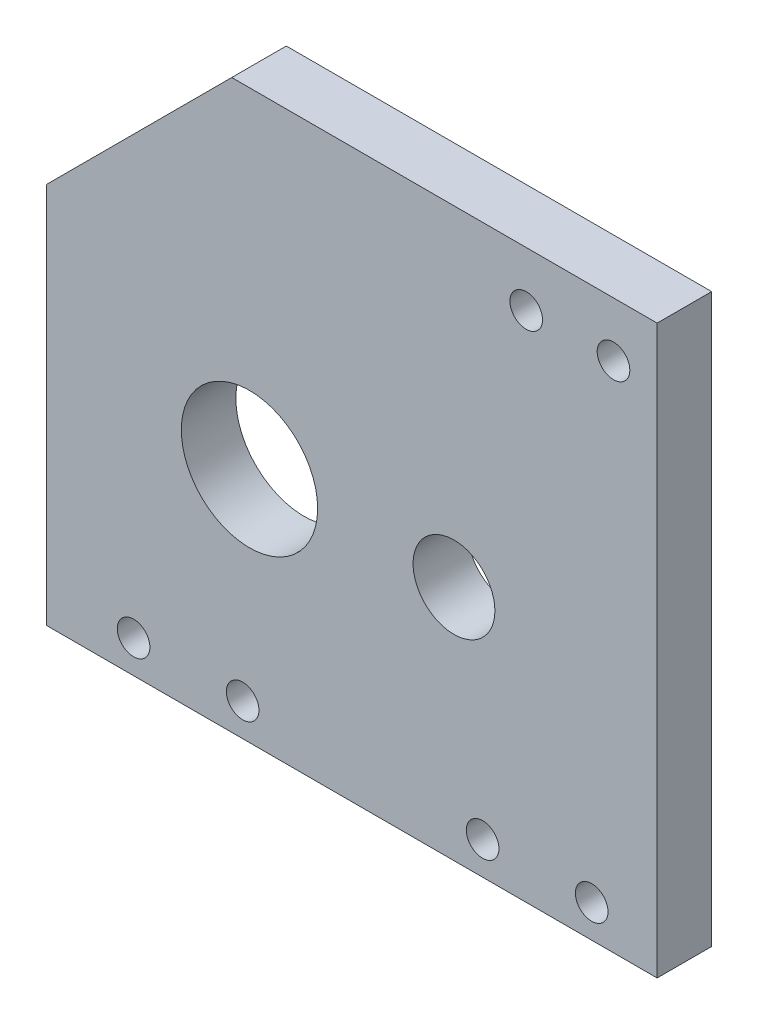
ISO-10303-21;
HEADER;
FILE_DESCRIPTION(('STEP AP214'),'2;1');
FILE_NAME('part.step','',(''),(''),'','','');
FILE_SCHEMA(('AUTOMOTIVE_DESIGN { 1 0 10303 214 1 1 1 1 }'));
ENDSEC;
DATA;
#1=APPLICATION_CONTEXT('core data for automotive mechanical design processes');
#2=APPLICATION_PROTOCOL_DEFINITION('international standard','automotive_design',2000,#1);
#3=PRODUCT_CONTEXT('',#1,'mechanical');
#4=PRODUCT('Part','Part','',(#3));
#5=PRODUCT_RELATED_PRODUCT_CATEGORY('part','',(#4));
#6=PRODUCT_DEFINITION_FORMATION('','',#4);
#7=PRODUCT_DEFINITION_CONTEXT('part definition',#1,'design');
#8=PRODUCT_DEFINITION('design','',#6,#7);
#9=PRODUCT_DEFINITION_SHAPE('','',#8);
#10=(LENGTH_UNIT() NAMED_UNIT(*) SI_UNIT(.MILLI.,.METRE.));
#11=(NAMED_UNIT(*) PLANE_ANGLE_UNIT() SI_UNIT($,.RADIAN.));
#12=(NAMED_UNIT(*) SI_UNIT($,.STERADIAN.) SOLID_ANGLE_UNIT());
#13=UNCERTAINTY_MEASURE_WITH_UNIT(LENGTH_MEASURE(1.E-05),#10,'distance_accuracy_value','');
#14=(GEOMETRIC_REPRESENTATION_CONTEXT(3) GLOBAL_UNCERTAINTY_ASSIGNED_CONTEXT((#13)) GLOBAL_UNIT_ASSIGNED_CONTEXT((#10,
#11,#12)) REPRESENTATION_CONTEXT('',''));
#15=CARTESIAN_POINT('',(0.,0.,0.));
#16=DIRECTION('',(0.,0.,1.));
#17=DIRECTION('',(1.,0.,0.));
#18=AXIS2_PLACEMENT_3D('',#15,#16,#17);
#19=CARTESIAN_POINT('',(0.,0.,6.35));
#20=DIRECTION('',(0.,0.,1.));
#21=DIRECTION('',(1.,0.,0.));
#22=AXIS2_PLACEMENT_3D('',#19,#20,#21);
#23=PLANE('',#22);
#24=CARTESIAN_POINT('',(20.32,26.67,6.35));
#25=DIRECTION('',(0.,0.,1.));
#26=DIRECTION('',(1.,0.,0.));
#27=AXIS2_PLACEMENT_3D('',#24,#25,#26);
#28=CIRCLE('',#27,1.89864999999999);
#29=CARTESIAN_POINT('',(22.21865,26.67,6.35));
#30=VERTEX_POINT('',#29);
#31=EDGE_CURVE('E173',#30,#30,#28,.T.);
#32=ORIENTED_EDGE('',*,*,#31,.F.);
#33=EDGE_LOOP('',(#32));
#34=FACE_BOUND('',#33,.T.);
#35=CARTESIAN_POINT('',(30.48,26.67,6.35));
#36=DIRECTION('',(0.,0.,1.));
#37=DIRECTION('',(1.,0.,0.));
#38=AXIS2_PLACEMENT_3D('',#35,#36,#37);
#39=CIRCLE('',#38,1.89864999999999);
#40=CARTESIAN_POINT('',(32.37865,26.67,6.35));
#41=VERTEX_POINT('',#40);
#42=EDGE_CURVE('E167',#41,#41,#39,.T.);
#43=ORIENTED_EDGE('',*,*,#42,.F.);
#44=EDGE_LOOP('',(#43));
#45=FACE_BOUND('',#44,.T.);
#46=DIRECTION('',(0.707106781186547,0.707106781186548,0.));
#47=VECTOR('',#46,1.);
#48=CARTESIAN_POINT('',(-13.97,33.02,6.35));
#49=LINE('',#48,#47);
#50=CARTESIAN_POINT('',(-35.56,11.43,6.35));
#51=VERTEX_POINT('',#50);
#52=CARTESIAN_POINT('',(-13.97,33.02,6.35));
#53=VERTEX_POINT('',#52);
#54=EDGE_CURVE('E48',#51,#53,#49,.T.);
#55=ORIENTED_EDGE('',*,*,#54,.F.);
#56=DIRECTION('',(0.,-1.,0.));
#57=VECTOR('',#56,1.);
#58=CARTESIAN_POINT('',(-35.56,-33.02,6.35));
#59=LINE('',#58,#57);
#60=CARTESIAN_POINT('',(-35.56,-33.02,6.35));
#61=VERTEX_POINT('',#60);
#62=EDGE_CURVE('E78',#51,#61,#59,.T.);
#63=ORIENTED_EDGE('',*,*,#62,.T.);
#64=DIRECTION('',(1.,0.,0.));
#65=VECTOR('',#64,1.);
#66=CARTESIAN_POINT('',(35.56,-33.02,6.35));
#67=LINE('',#66,#65);
#68=CARTESIAN_POINT('',(35.56,-33.02,6.35));
#69=VERTEX_POINT('',#68);
#70=EDGE_CURVE('E108',#61,#69,#67,.T.);
#71=ORIENTED_EDGE('',*,*,#70,.T.);
#72=DIRECTION('',(0.,1.,0.));
#73=VECTOR('',#72,1.);
#74=CARTESIAN_POINT('',(35.56,-33.02,6.35));
#75=LINE('',#74,#73);
#76=CARTESIAN_POINT('',(35.56,33.02,6.35));
#77=VERTEX_POINT('',#76);
#78=EDGE_CURVE('E57',#69,#77,#75,.T.);
#79=ORIENTED_EDGE('',*,*,#78,.T.);
#80=DIRECTION('',(-1.,0.,0.));
#81=VECTOR('',#80,1.);
#82=CARTESIAN_POINT('',(35.56,33.02,6.35));
#83=LINE('',#82,#81);
#84=EDGE_CURVE('E114',#77,#53,#83,.T.);
#85=ORIENTED_EDGE('',*,*,#84,.T.);
#86=EDGE_LOOP('',(#55,#63,#71,#79,#85));
#87=FACE_BOUND('',#86,.T.);
#88=CARTESIAN_POINT('',(-25.4,-29.21,6.35));
#89=DIRECTION('',(0.,0.,1.));
#90=DIRECTION('',(1.,0.,0.));
#91=AXIS2_PLACEMENT_3D('',#88,#89,#90);
#92=CIRCLE('',#91,1.89864999999999);
#93=CARTESIAN_POINT('',(-23.50135,-29.21,6.35));
#94=VERTEX_POINT('',#93);
#95=EDGE_CURVE('E159',#94,#94,#92,.T.);
#96=ORIENTED_EDGE('',*,*,#95,.F.);
#97=EDGE_LOOP('',(#96));
#98=FACE_BOUND('',#97,.T.);
#99=CARTESIAN_POINT('',(-12.7,-29.21,6.35));
#100=DIRECTION('',(0.,0.,1.));
#101=DIRECTION('',(1.,0.,0.));
#102=AXIS2_PLACEMENT_3D('',#99,#100,#101);
#103=CIRCLE('',#102,1.89864999999999);
#104=CARTESIAN_POINT('',(-10.80135,-29.21,6.35));
#105=VERTEX_POINT('',#104);
#106=EDGE_CURVE('E153',#105,#105,#103,.T.);
#107=ORIENTED_EDGE('',*,*,#106,.F.);
#108=EDGE_LOOP('',(#107));
#109=FACE_BOUND('',#108,.T.);
#110=CARTESIAN_POINT('',(15.24,-29.21,6.35));
#111=DIRECTION('',(0.,0.,1.));
#112=DIRECTION('',(1.,0.,0.));
#113=AXIS2_PLACEMENT_3D('',#110,#111,#112);
#114=CIRCLE('',#113,1.89864999999999);
#115=CARTESIAN_POINT('',(17.13865,-29.21,6.35));
#116=VERTEX_POINT('',#115);
#117=EDGE_CURVE('E147',#116,#116,#114,.T.);
#118=ORIENTED_EDGE('',*,*,#117,.F.);
#119=EDGE_LOOP('',(#118));
#120=FACE_BOUND('',#119,.T.);
#121=CARTESIAN_POINT('',(27.94,-29.21,6.35));
#122=DIRECTION('',(0.,0.,1.));
#123=DIRECTION('',(1.,0.,0.));
#124=AXIS2_PLACEMENT_3D('',#121,#122,#123);
#125=CIRCLE('',#124,1.89864999999999);
#126=CARTESIAN_POINT('',(29.83865,-29.21,6.35));
#127=VERTEX_POINT('',#126);
#128=EDGE_CURVE('E141',#127,#127,#125,.T.);
#129=ORIENTED_EDGE('',*,*,#128,.F.);
#130=EDGE_LOOP('',(#129));
#131=FACE_BOUND('',#130,.T.);
#132=CARTESIAN_POINT('',(-11.90625,-5.43814,6.35));
#133=DIRECTION('',(0.,0.,1.));
#134=DIRECTION('',(1.,0.,0.));
#135=AXIS2_PLACEMENT_3D('',#132,#133,#134);
#136=CIRCLE('',#135,7.9375);
#137=CARTESIAN_POINT('',(-3.96875,-5.43814,6.35));
#138=VERTEX_POINT('',#137);
#139=EDGE_CURVE('E121',#138,#138,#136,.T.);
#140=ORIENTED_EDGE('',*,*,#139,.F.);
#141=EDGE_LOOP('',(#140));
#142=FACE_BOUND('',#141,.T.);
#143=CARTESIAN_POINT('',(11.90625,-5.43814,6.35));
#144=DIRECTION('',(0.,0.,1.));
#145=DIRECTION('',(1.,0.,0.));
#146=AXIS2_PLACEMENT_3D('',#143,#144,#145);
#147=CIRCLE('',#146,4.7625);
#148=CARTESIAN_POINT('',(16.66875,-5.43814,6.35));
#149=VERTEX_POINT('',#148);
#150=EDGE_CURVE('E131',#149,#149,#147,.T.);
#151=ORIENTED_EDGE('',*,*,#150,.F.);
#152=EDGE_LOOP('',(#151));
#153=FACE_BOUND('',#152,.T.);
#154=ADVANCED_FACE('F33',(#34,#45,#87,#98,#109,#120,#131,#142,#153),#23,.T.);
#155=CARTESIAN_POINT('',(0.,0.,0.));
#156=DIRECTION('',(0.,0.,1.));
#157=DIRECTION('',(1.,0.,0.));
#158=AXIS2_PLACEMENT_3D('',#155,#156,#157);
#159=PLANE('',#158);
#160=CARTESIAN_POINT('',(20.32,26.67,0.));
#161=DIRECTION('',(0.,0.,1.));
#162=DIRECTION('',(1.,0.,0.));
#163=AXIS2_PLACEMENT_3D('',#160,#161,#162);
#164=CIRCLE('',#163,1.89864999999999);
#165=CARTESIAN_POINT('',(22.21865,26.67,0.));
#166=VERTEX_POINT('',#165);
#167=EDGE_CURVE('E170',#166,#166,#164,.T.);
#168=ORIENTED_EDGE('',*,*,#167,.T.);
#169=EDGE_LOOP('',(#168));
#170=FACE_BOUND('',#169,.T.);
#171=CARTESIAN_POINT('',(30.48,26.67,0.));
#172=DIRECTION('',(0.,0.,1.));
#173=DIRECTION('',(1.,0.,0.));
#174=AXIS2_PLACEMENT_3D('',#171,#172,#173);
#175=CIRCLE('',#174,1.89864999999999);
#176=CARTESIAN_POINT('',(32.37865,26.67,0.));
#177=VERTEX_POINT('',#176);
#178=EDGE_CURVE('E163',#177,#177,#175,.T.);
#179=ORIENTED_EDGE('',*,*,#178,.T.);
#180=EDGE_LOOP('',(#179));
#181=FACE_BOUND('',#180,.T.);
#182=CARTESIAN_POINT('',(-25.4,-29.21,0.));
#183=DIRECTION('',(0.,0.,1.));
#184=DIRECTION('',(1.,0.,0.));
#185=AXIS2_PLACEMENT_3D('',#182,#183,#184);
#186=CIRCLE('',#185,1.89864999999999);
#187=CARTESIAN_POINT('',(-23.50135,-29.21,0.));
#188=VERTEX_POINT('',#187);
#189=EDGE_CURVE('E156',#188,#188,#186,.T.);
#190=ORIENTED_EDGE('',*,*,#189,.T.);
#191=EDGE_LOOP('',(#190));
#192=FACE_BOUND('',#191,.T.);
#193=CARTESIAN_POINT('',(-12.7,-29.21,0.));
#194=DIRECTION('',(0.,0.,1.));
#195=DIRECTION('',(1.,0.,0.));
#196=AXIS2_PLACEMENT_3D('',#193,#194,#195);
#197=CIRCLE('',#196,1.89864999999999);
#198=CARTESIAN_POINT('',(-10.80135,-29.21,0.));
#199=VERTEX_POINT('',#198);
#200=EDGE_CURVE('E150',#199,#199,#197,.T.);
#201=ORIENTED_EDGE('',*,*,#200,.T.);
#202=EDGE_LOOP('',(#201));
#203=FACE_BOUND('',#202,.T.);
#204=CARTESIAN_POINT('',(15.24,-29.21,0.));
#205=DIRECTION('',(0.,0.,1.));
#206=DIRECTION('',(1.,0.,0.));
#207=AXIS2_PLACEMENT_3D('',#204,#205,#206);
#208=CIRCLE('',#207,1.89864999999999);
#209=CARTESIAN_POINT('',(17.13865,-29.21,0.));
#210=VERTEX_POINT('',#209);
#211=EDGE_CURVE('E144',#210,#210,#208,.T.);
#212=ORIENTED_EDGE('',*,*,#211,.T.);
#213=EDGE_LOOP('',(#212));
#214=FACE_BOUND('',#213,.T.);
#215=CARTESIAN_POINT('',(27.94,-29.21,0.));
#216=DIRECTION('',(0.,0.,1.));
#217=DIRECTION('',(1.,0.,0.));
#218=AXIS2_PLACEMENT_3D('',#215,#216,#217);
#219=CIRCLE('',#218,1.89864999999999);
#220=CARTESIAN_POINT('',(29.83865,-29.21,0.));
#221=VERTEX_POINT('',#220);
#222=EDGE_CURVE('E136',#221,#221,#219,.T.);
#223=ORIENTED_EDGE('',*,*,#222,.T.);
#224=EDGE_LOOP('',(#223));
#225=FACE_BOUND('',#224,.T.);
#226=DIRECTION('',(0.,-1.,0.));
#227=VECTOR('',#226,1.);
#228=CARTESIAN_POINT('',(-35.56,-33.02,0.));
#229=LINE('',#228,#227);
#230=CARTESIAN_POINT('',(-35.56,11.43,0.));
#231=VERTEX_POINT('',#230);
#232=CARTESIAN_POINT('',(-35.56,-33.02,0.));
#233=VERTEX_POINT('',#232);
#234=EDGE_CURVE('E103',#231,#233,#229,.T.);
#235=ORIENTED_EDGE('',*,*,#234,.F.);
#236=DIRECTION('',(0.707106781186547,0.707106781186548,0.));
#237=VECTOR('',#236,1.);
#238=CARTESIAN_POINT('',(-13.97,33.02,0.));
#239=LINE('',#238,#237);
#240=CARTESIAN_POINT('',(-13.97,33.02,0.));
#241=VERTEX_POINT('',#240);
#242=EDGE_CURVE('E89',#231,#241,#239,.T.);
#243=ORIENTED_EDGE('',*,*,#242,.T.);
#244=DIRECTION('',(-1.,0.,0.));
#245=VECTOR('',#244,1.);
#246=CARTESIAN_POINT('',(35.56,33.02,0.));
#247=LINE('',#246,#245);
#248=CARTESIAN_POINT('',(35.56,33.02,0.));
#249=VERTEX_POINT('',#248);
#250=EDGE_CURVE('E101',#249,#241,#247,.T.);
#251=ORIENTED_EDGE('',*,*,#250,.F.);
#252=DIRECTION('',(0.,1.,0.));
#253=VECTOR('',#252,1.);
#254=CARTESIAN_POINT('',(35.56,-33.02,0.));
#255=LINE('',#254,#253);
#256=CARTESIAN_POINT('',(35.56,-33.02,0.));
#257=VERTEX_POINT('',#256);
#258=EDGE_CURVE('E74',#257,#249,#255,.T.);
#259=ORIENTED_EDGE('',*,*,#258,.F.);
#260=DIRECTION('',(1.,0.,0.));
#261=VECTOR('',#260,1.);
#262=CARTESIAN_POINT('',(35.56,-33.02,0.));
#263=LINE('',#262,#261);
#264=EDGE_CURVE('E110',#233,#257,#263,.T.);
#265=ORIENTED_EDGE('',*,*,#264,.F.);
#266=EDGE_LOOP('',(#235,#243,#251,#259,#265));
#267=FACE_BOUND('',#266,.T.);
#268=CARTESIAN_POINT('',(-11.90625,-5.43814,0.));
#269=DIRECTION('',(0.,0.,1.));
#270=DIRECTION('',(1.,0.,0.));
#271=AXIS2_PLACEMENT_3D('',#268,#269,#270);
#272=CIRCLE('',#271,7.9375);
#273=CARTESIAN_POINT('',(-3.96875,-5.43814,0.));
#274=VERTEX_POINT('',#273);
#275=EDGE_CURVE('E124',#274,#274,#272,.T.);
#276=ORIENTED_EDGE('',*,*,#275,.T.);
#277=EDGE_LOOP('',(#276));
#278=FACE_BOUND('',#277,.T.);
#279=CARTESIAN_POINT('',(11.90625,-5.43814,0.));
#280=DIRECTION('',(0.,0.,1.));
#281=DIRECTION('',(1.,0.,0.));
#282=AXIS2_PLACEMENT_3D('',#279,#280,#281);
#283=CIRCLE('',#282,4.7625);
#284=CARTESIAN_POINT('',(16.66875,-5.43814,0.));
#285=VERTEX_POINT('',#284);
#286=EDGE_CURVE('E133',#285,#285,#283,.T.);
#287=ORIENTED_EDGE('',*,*,#286,.T.);
#288=EDGE_LOOP('',(#287));
#289=FACE_BOUND('',#288,.T.);
#290=ADVANCED_FACE('F99',(#170,#181,#192,#203,#214,#225,#267,#278,#289),#159,.F.);
#291=CARTESIAN_POINT('',(-35.56,-33.02,6.35));
#292=DIRECTION('',(1.,0.,0.));
#293=DIRECTION('',(0.,0.,-1.));
#294=AXIS2_PLACEMENT_3D('',#291,#292,#293);
#295=PLANE('',#294);
#296=ORIENTED_EDGE('',*,*,#62,.F.);
#297=DIRECTION('',(0.,0.,1.));
#298=VECTOR('',#297,1.);
#299=CARTESIAN_POINT('',(-35.56,11.43,0.));
#300=LINE('',#299,#298);
#301=EDGE_CURVE('E94',#231,#51,#300,.T.);
#302=ORIENTED_EDGE('',*,*,#301,.F.);
#303=ORIENTED_EDGE('',*,*,#234,.T.);
#304=DIRECTION('',(0.,0.,-1.));
#305=VECTOR('',#304,1.);
#306=CARTESIAN_POINT('',(-35.56,-33.02,6.35));
#307=LINE('',#306,#305);
#308=EDGE_CURVE('E11',#61,#233,#307,.T.);
#309=ORIENTED_EDGE('',*,*,#308,.F.);
#310=EDGE_LOOP('',(#296,#302,#303,#309));
#311=FACE_BOUND('',#310,.T.);
#312=ADVANCED_FACE('F35',(#311),#295,.F.);
#313=CARTESIAN_POINT('',(35.56,-33.02,6.35));
#314=DIRECTION('',(0.,1.,0.));
#315=DIRECTION('',(-1.,0.,0.));
#316=AXIS2_PLACEMENT_3D('',#313,#314,#315);
#317=PLANE('',#316);
#318=ORIENTED_EDGE('',*,*,#264,.T.);
#319=DIRECTION('',(0.,0.,-1.));
#320=VECTOR('',#319,1.);
#321=CARTESIAN_POINT('',(35.56,-33.02,6.35));
#322=LINE('',#321,#320);
#323=EDGE_CURVE('E41',#69,#257,#322,.T.);
#324=ORIENTED_EDGE('',*,*,#323,.F.);
#325=ORIENTED_EDGE('',*,*,#70,.F.);
#326=ORIENTED_EDGE('',*,*,#308,.T.);
#327=EDGE_LOOP('',(#318,#324,#325,#326));
#328=FACE_BOUND('',#327,.T.);
#329=ADVANCED_FACE('F119',(#328),#317,.F.);
#330=CARTESIAN_POINT('',(35.56,-33.02,6.35));
#331=DIRECTION('',(-1.,0.,0.));
#332=DIRECTION('',(0.,0.,1.));
#333=AXIS2_PLACEMENT_3D('',#330,#331,#332);
#334=PLANE('',#333);
#335=ORIENTED_EDGE('',*,*,#258,.T.);
#336=DIRECTION('',(0.,0.,-1.));
#337=VECTOR('',#336,1.);
#338=CARTESIAN_POINT('',(35.56,33.02,6.35));
#339=LINE('',#338,#337);
#340=EDGE_CURVE('E106',#77,#249,#339,.T.);
#341=ORIENTED_EDGE('',*,*,#340,.F.);
#342=ORIENTED_EDGE('',*,*,#78,.F.);
#343=ORIENTED_EDGE('',*,*,#323,.T.);
#344=EDGE_LOOP('',(#335,#341,#342,#343));
#345=FACE_BOUND('',#344,.T.);
#346=ADVANCED_FACE('F116',(#345),#334,.F.);
#347=CARTESIAN_POINT('',(35.56,33.02,6.35));
#348=DIRECTION('',(0.,-1.,0.));
#349=DIRECTION('',(1.,0.,0.));
#350=AXIS2_PLACEMENT_3D('',#347,#348,#349);
#351=PLANE('',#350);
#352=ORIENTED_EDGE('',*,*,#250,.T.);
#353=DIRECTION('',(0.,0.,1.));
#354=VECTOR('',#353,1.);
#355=CARTESIAN_POINT('',(-13.97,33.02,0.));
#356=LINE('',#355,#354);
#357=EDGE_CURVE('E86',#241,#53,#356,.T.);
#358=ORIENTED_EDGE('',*,*,#357,.T.);
#359=ORIENTED_EDGE('',*,*,#84,.F.);
#360=ORIENTED_EDGE('',*,*,#340,.T.);
#361=EDGE_LOOP('',(#352,#358,#359,#360));
#362=FACE_BOUND('',#361,.T.);
#363=ADVANCED_FACE('F105',(#362),#351,.F.);
#364=CARTESIAN_POINT('',(-11.90625,-5.43814,6.35));
#365=DIRECTION('',(0.,0.,-1.));
#366=DIRECTION('',(-1.,0.,0.));
#367=AXIS2_PLACEMENT_3D('',#364,#365,#366);
#368=CYLINDRICAL_SURFACE('',#367,7.9375);
#369=ORIENTED_EDGE('',*,*,#139,.T.);
#370=EDGE_LOOP('',(#369));
#371=FACE_BOUND('',#370,.T.);
#372=ORIENTED_EDGE('',*,*,#275,.F.);
#373=EDGE_LOOP('',(#372));
#374=FACE_BOUND('',#373,.T.);
#375=ADVANCED_FACE('F200',(#371,#374),#368,.F.);
#376=CARTESIAN_POINT('',(11.90625,-5.43814,6.35));
#377=DIRECTION('',(0.,0.,-1.));
#378=DIRECTION('',(-1.,0.,0.));
#379=AXIS2_PLACEMENT_3D('',#376,#377,#378);
#380=CYLINDRICAL_SURFACE('',#379,4.7625);
#381=ORIENTED_EDGE('',*,*,#150,.T.);
#382=EDGE_LOOP('',(#381));
#383=FACE_BOUND('',#382,.T.);
#384=ORIENTED_EDGE('',*,*,#286,.F.);
#385=EDGE_LOOP('',(#384));
#386=FACE_BOUND('',#385,.T.);
#387=ADVANCED_FACE('F196',(#383,#386),#380,.F.);
#388=CARTESIAN_POINT('',(27.94,-29.21,6.35));
#389=DIRECTION('',(0.,0.,1.));
#390=DIRECTION('',(1.,0.,0.));
#391=AXIS2_PLACEMENT_3D('',#388,#389,#390);
#392=CYLINDRICAL_SURFACE('',#391,1.89864999999999);
#393=ORIENTED_EDGE('',*,*,#222,.F.);
#394=EDGE_LOOP('',(#393));
#395=FACE_BOUND('',#394,.T.);
#396=ORIENTED_EDGE('',*,*,#128,.T.);
#397=EDGE_LOOP('',(#396));
#398=FACE_BOUND('',#397,.T.);
#399=ADVANCED_FACE('F199',(#395,#398),#392,.F.);
#400=CARTESIAN_POINT('',(15.24,-29.21,6.35));
#401=DIRECTION('',(0.,0.,1.));
#402=DIRECTION('',(1.,0.,0.));
#403=AXIS2_PLACEMENT_3D('',#400,#401,#402);
#404=CYLINDRICAL_SURFACE('',#403,1.89864999999999);
#405=ORIENTED_EDGE('',*,*,#211,.F.);
#406=EDGE_LOOP('',(#405));
#407=FACE_BOUND('',#406,.T.);
#408=ORIENTED_EDGE('',*,*,#117,.T.);
#409=EDGE_LOOP('',(#408));
#410=FACE_BOUND('',#409,.T.);
#411=ADVANCED_FACE('F247',(#407,#410),#404,.F.);
#412=CARTESIAN_POINT('',(-12.7,-29.21,6.35));
#413=DIRECTION('',(0.,0.,1.));
#414=DIRECTION('',(1.,0.,0.));
#415=AXIS2_PLACEMENT_3D('',#412,#413,#414);
#416=CYLINDRICAL_SURFACE('',#415,1.89864999999999);
#417=ORIENTED_EDGE('',*,*,#200,.F.);
#418=EDGE_LOOP('',(#417));
#419=FACE_BOUND('',#418,.T.);
#420=ORIENTED_EDGE('',*,*,#106,.T.);
#421=EDGE_LOOP('',(#420));
#422=FACE_BOUND('',#421,.T.);
#423=ADVANCED_FACE('F255',(#419,#422),#416,.F.);
#424=CARTESIAN_POINT('',(-25.4,-29.21,6.35));
#425=DIRECTION('',(0.,0.,1.));
#426=DIRECTION('',(1.,0.,0.));
#427=AXIS2_PLACEMENT_3D('',#424,#425,#426);
#428=CYLINDRICAL_SURFACE('',#427,1.89864999999999);
#429=ORIENTED_EDGE('',*,*,#189,.F.);
#430=EDGE_LOOP('',(#429));
#431=FACE_BOUND('',#430,.T.);
#432=ORIENTED_EDGE('',*,*,#95,.T.);
#433=EDGE_LOOP('',(#432));
#434=FACE_BOUND('',#433,.T.);
#435=ADVANCED_FACE('F263',(#431,#434),#428,.F.);
#436=CARTESIAN_POINT('',(-13.97,33.02,0.));
#437=DIRECTION('',(0.707106781186548,-0.707106781186547,0.));
#438=DIRECTION('',(0.707106781186547,0.707106781186548,0.));
#439=AXIS2_PLACEMENT_3D('',#436,#437,#438);
#440=PLANE('',#439);
#441=ORIENTED_EDGE('',*,*,#54,.T.);
#442=ORIENTED_EDGE('',*,*,#357,.F.);
#443=ORIENTED_EDGE('',*,*,#242,.F.);
#444=ORIENTED_EDGE('',*,*,#301,.T.);
#445=EDGE_LOOP('',(#441,#442,#443,#444));
#446=FACE_BOUND('',#445,.T.);
#447=ADVANCED_FACE('F88',(#446),#440,.F.);
#448=CARTESIAN_POINT('',(30.48,26.67,6.35));
#449=DIRECTION('',(0.,0.,1.));
#450=DIRECTION('',(1.,0.,0.));
#451=AXIS2_PLACEMENT_3D('',#448,#449,#450);
#452=CYLINDRICAL_SURFACE('',#451,1.89864999999999);
#453=ORIENTED_EDGE('',*,*,#178,.F.);
#454=EDGE_LOOP('',(#453));
#455=FACE_BOUND('',#454,.T.);
#456=ORIENTED_EDGE('',*,*,#42,.T.);
#457=EDGE_LOOP('',(#456));
#458=FACE_BOUND('',#457,.T.);
#459=ADVANCED_FACE('F277',(#455,#458),#452,.F.);
#460=CARTESIAN_POINT('',(20.32,26.67,6.35));
#461=DIRECTION('',(0.,0.,1.));
#462=DIRECTION('',(1.,0.,0.));
#463=AXIS2_PLACEMENT_3D('',#460,#461,#462);
#464=CYLINDRICAL_SURFACE('',#463,1.89864999999999);
#465=ORIENTED_EDGE('',*,*,#167,.F.);
#466=EDGE_LOOP('',(#465));
#467=FACE_BOUND('',#466,.T.);
#468=ORIENTED_EDGE('',*,*,#31,.T.);
#469=EDGE_LOOP('',(#468));
#470=FACE_BOUND('',#469,.T.);
#471=ADVANCED_FACE('F177',(#467,#470),#464,.F.);
#472=CLOSED_SHELL('',(#154,#290,#312,#329,#346,#363,#375,#387,#399,#411,#423,#435,#447,#459,#471));
#473=MANIFOLD_SOLID_BREP('B2',#472);
#474=ADVANCED_BREP_SHAPE_REPRESENTATION('',(#18,#473),#14);
#475=SHAPE_DEFINITION_REPRESENTATION(#9,#474);
ENDSEC;
END-ISO-10303-21;
